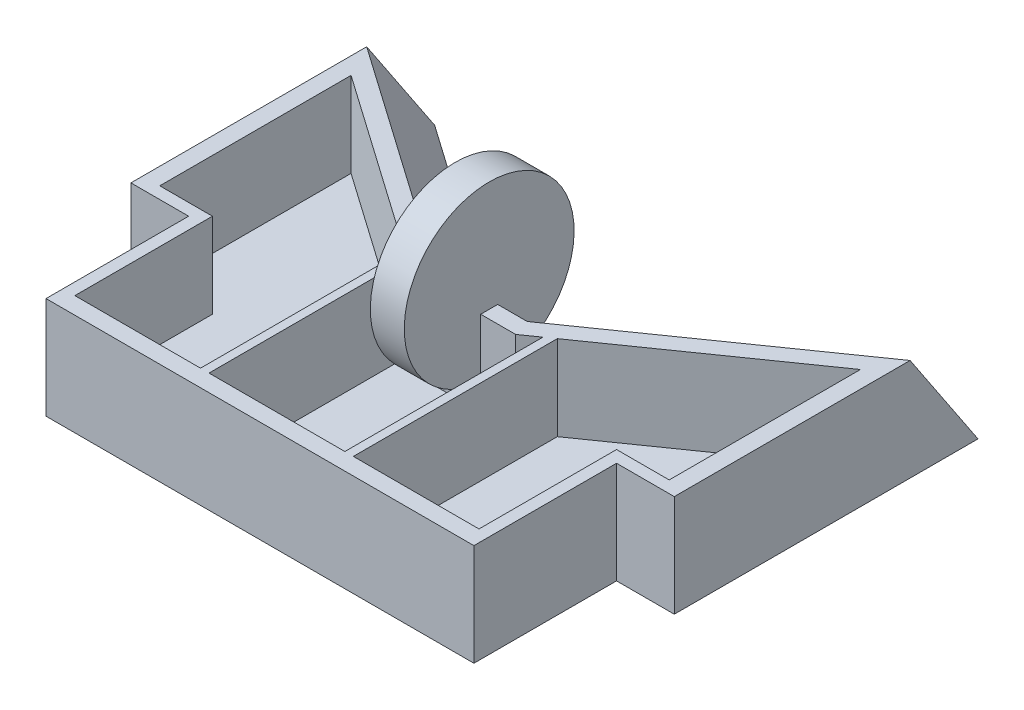
ISO-10303-21;
HEADER;
FILE_DESCRIPTION(('STEP AP214'),'2;1');
FILE_NAME('part.step','',(''),(''),'','','');
FILE_SCHEMA(('AUTOMOTIVE_DESIGN { 1 0 10303 214 1 1 1 1 }'));
ENDSEC;
DATA;
#1=APPLICATION_CONTEXT('core data for automotive mechanical design processes');
#2=APPLICATION_PROTOCOL_DEFINITION('international standard','automotive_design',2000,#1);
#3=PRODUCT_CONTEXT('',#1,'mechanical');
#4=PRODUCT('Part','Part','',(#3));
#5=PRODUCT_RELATED_PRODUCT_CATEGORY('part','',(#4));
#6=PRODUCT_DEFINITION_FORMATION('','',#4);
#7=PRODUCT_DEFINITION_CONTEXT('part definition',#1,'design');
#8=PRODUCT_DEFINITION('design','',#6,#7);
#9=PRODUCT_DEFINITION_SHAPE('','',#8);
#10=(LENGTH_UNIT() NAMED_UNIT(*) SI_UNIT(.MILLI.,.METRE.));
#11=(NAMED_UNIT(*) PLANE_ANGLE_UNIT() SI_UNIT($,.RADIAN.));
#12=(NAMED_UNIT(*) SI_UNIT($,.STERADIAN.) SOLID_ANGLE_UNIT());
#13=UNCERTAINTY_MEASURE_WITH_UNIT(LENGTH_MEASURE(1.E-05),#10,'distance_accuracy_value','');
#14=(GEOMETRIC_REPRESENTATION_CONTEXT(3) GLOBAL_UNCERTAINTY_ASSIGNED_CONTEXT((#13)) GLOBAL_UNIT_ASSIGNED_CONTEXT((#10,
#11,#12)) REPRESENTATION_CONTEXT('',''));
#15=CARTESIAN_POINT('',(0.,0.,0.));
#16=DIRECTION('',(0.,0.,1.));
#17=DIRECTION('',(1.,0.,0.));
#18=AXIS2_PLACEMENT_3D('',#15,#16,#17);
#19=CARTESIAN_POINT('',(-75.5649999999984,-226.739284890193,61.6029072057912));
#20=DIRECTION('',(0.,0.,1.));
#21=DIRECTION('',(1.,0.,0.));
#22=AXIS2_PLACEMENT_3D('',#19,#20,#21);
#23=PLANE('',#22);
#24=DIRECTION('',(0.,-1.,0.));
#25=VECTOR('',#24,1.);
#26=CARTESIAN_POINT('',(25.3999999999968,114.444963656099,61.6029072057911));
#27=LINE('',#26,#25);
#28=CARTESIAN_POINT('',(25.3999999999967,38.1,61.6029072057911));
#29=VERTEX_POINT('',#28);
#30=CARTESIAN_POINT('',(25.3999999999968,6.34999999999999,61.6029072057911));
#31=VERTEX_POINT('',#30);
#32=EDGE_CURVE('E283',#29,#31,#27,.T.);
#33=ORIENTED_EDGE('',*,*,#32,.T.);
#34=DIRECTION('',(-1.,0.,0.));
#35=VECTOR('',#34,1.);
#36=CARTESIAN_POINT('',(-75.5649999999984,6.34999999999999,61.6029072057912));
#37=LINE('',#36,#35);
#38=CARTESIAN_POINT('',(-25.3999999999968,6.35,61.6029072057912));
#39=VERTEX_POINT('',#38);
#40=EDGE_CURVE('E344',#31,#39,#37,.T.);
#41=ORIENTED_EDGE('',*,*,#40,.T.);
#42=DIRECTION('',(0.,-1.,0.));
#43=VECTOR('',#42,1.);
#44=CARTESIAN_POINT('',(-25.3999999999968,114.444963656099,61.6029072057912));
#45=LINE('',#44,#43);
#46=CARTESIAN_POINT('',(-25.3999999999968,38.1,61.6029072057912));
#47=VERTEX_POINT('',#46);
#48=EDGE_CURVE('E304',#47,#39,#45,.T.);
#49=ORIENTED_EDGE('',*,*,#48,.F.);
#50=DIRECTION('',(1.,0.,0.));
#51=VECTOR('',#50,1.);
#52=CARTESIAN_POINT('',(-75.5649999999984,38.1,61.6029072057912));
#53=LINE('',#52,#51);
#54=EDGE_CURVE('E349',#47,#29,#53,.T.);
#55=ORIENTED_EDGE('',*,*,#54,.T.);
#56=EDGE_LOOP('',(#33,#41,#49,#55));
#57=FACE_BOUND('',#56,.T.);
#58=ADVANCED_FACE('F37',(#57),#23,.F.);
#59=DIRECTION('',(0.,-1.,0.));
#60=VECTOR('',#59,1.);
#61=CARTESIAN_POINT('',(28.5749999999968,114.444963656099,61.6029072057911));
#62=LINE('',#61,#60);
#63=CARTESIAN_POINT('',(28.5749999999968,38.1,61.6029072057911));
#64=VERTEX_POINT('',#63);
#65=CARTESIAN_POINT('',(28.5749999999968,6.34999999999999,61.6029072057911));
#66=VERTEX_POINT('',#65);
#67=EDGE_CURVE('E279',#64,#66,#62,.T.);
#68=ORIENTED_EDGE('',*,*,#67,.F.);
#69=CARTESIAN_POINT('',(75.5649999999985,38.1,61.6029072057911));
#70=VERTEX_POINT('',#69);
#71=EDGE_CURVE('E308',#64,#70,#53,.T.);
#72=ORIENTED_EDGE('',*,*,#71,.T.);
#73=DIRECTION('',(0.,1.,0.));
#74=VECTOR('',#73,1.);
#75=CARTESIAN_POINT('',(75.5649999999985,-226.739284890193,61.6029072057911));
#76=LINE('',#75,#74);
#77=CARTESIAN_POINT('',(75.5649999999985,6.34999999999999,61.6029072057911));
#78=VERTEX_POINT('',#77);
#79=EDGE_CURVE('E377',#78,#70,#76,.T.);
#80=ORIENTED_EDGE('',*,*,#79,.F.);
#81=EDGE_CURVE('E340',#78,#66,#37,.T.);
#82=ORIENTED_EDGE('',*,*,#81,.T.);
#83=EDGE_LOOP('',(#68,#72,#80,#82));
#84=FACE_BOUND('',#83,.T.);
#85=ADVANCED_FACE('F533',(#84),#23,.F.);
#86=CARTESIAN_POINT('',(0.,6.35,0.));
#87=DIRECTION('',(0.,1.,0.));
#88=DIRECTION('',(0.,0.,1.));
#89=AXIS2_PLACEMENT_3D('',#86,#87,#88);
#90=PLANE('',#89);
#91=ORIENTED_EDGE('',*,*,#40,.F.);
#92=DIRECTION('',(0.,0.,1.));
#93=VECTOR('',#92,1.);
#94=CARTESIAN_POINT('',(25.3999999999968,6.35,-12.4528487101146));
#95=LINE('',#94,#93);
#96=CARTESIAN_POINT('',(25.3999999999967,6.34999999999999,-12.4528487101145));
#97=VERTEX_POINT('',#96);
#98=EDGE_CURVE('E280',#97,#31,#95,.T.);
#99=ORIENTED_EDGE('',*,*,#98,.F.);
#100=DIRECTION('',(0.819152044288991,0.,-0.573576436351048));
#101=VECTOR('',#100,1.);
#102=CARTESIAN_POINT('',(95.25,6.34999999999999,-61.3623452540652));
#103=LINE('',#102,#101);
#104=CARTESIAN_POINT('',(19.3935580718522,6.34999999999999,-8.24709279420883));
#105=VERTEX_POINT('',#104);
#106=EDGE_CURVE('E324',#105,#97,#103,.T.);
#107=ORIENTED_EDGE('',*,*,#106,.F.);
#108=DIRECTION('',(1.,0.,0.));
#109=VECTOR('',#108,1.);
#110=CARTESIAN_POINT('',(19.3935580718522,6.34999999999999,-8.24709279420884));
#111=LINE('',#110,#109);
#112=CARTESIAN_POINT('',(-19.3935580718522,6.34999999999999,-8.24709279420884));
#113=VERTEX_POINT('',#112);
#114=EDGE_CURVE('E327',#113,#105,#111,.T.);
#115=ORIENTED_EDGE('',*,*,#114,.F.);
#116=DIRECTION('',(0.819152044288991,0.,0.573576436351047));
#117=VECTOR('',#116,1.);
#118=CARTESIAN_POINT('',(-19.3935580718522,6.34999999999999,-8.24709279420884));
#119=LINE('',#118,#117);
#120=CARTESIAN_POINT('',(-25.3999999999968,6.35,-12.4528487101146));
#121=VERTEX_POINT('',#120);
#122=EDGE_CURVE('E329',#121,#113,#119,.T.);
#123=ORIENTED_EDGE('',*,*,#122,.F.);
#124=DIRECTION('',(0.,0.,-1.));
#125=VECTOR('',#124,1.);
#126=CARTESIAN_POINT('',(-25.3999999999968,6.35,-12.4528487101146));
#127=LINE('',#126,#125);
#128=EDGE_CURVE('E301',#39,#121,#127,.T.);
#129=ORIENTED_EDGE('',*,*,#128,.F.);
#130=EDGE_LOOP('',(#91,#99,#107,#115,#123,#129));
#131=FACE_BOUND('',#130,.T.);
#132=ADVANCED_FACE('F540',(#131),#90,.T.);
#133=CARTESIAN_POINT('',(28.5749999999968,6.34999999999999,-14.6760076439304));
#134=VERTEX_POINT('',#133);
#135=CARTESIAN_POINT('',(95.25,6.34999999999999,-61.3623452540652));
#136=VERTEX_POINT('',#135);
#137=EDGE_CURVE('E323',#134,#136,#103,.T.);
#138=ORIENTED_EDGE('',*,*,#137,.F.);
#139=DIRECTION('',(0.,0.,-1.));
#140=VECTOR('',#139,1.);
#141=CARTESIAN_POINT('',(28.5749999999968,6.35,61.6029072057911));
#142=LINE('',#141,#140);
#143=EDGE_CURVE('E275',#66,#134,#142,.T.);
#144=ORIENTED_EDGE('',*,*,#143,.F.);
#145=ORIENTED_EDGE('',*,*,#81,.F.);
#146=DIRECTION('',(0.,0.,1.));
#147=VECTOR('',#146,1.);
#148=CARTESIAN_POINT('',(75.5649999999985,6.34999999999999,61.6029072057911));
#149=LINE('',#148,#147);
#150=CARTESIAN_POINT('',(75.5649999999985,6.34999999999999,10.1679072057912));
#151=VERTEX_POINT('',#150);
#152=EDGE_CURVE('E343',#151,#78,#149,.T.);
#153=ORIENTED_EDGE('',*,*,#152,.F.);
#154=DIRECTION('',(-1.,0.,0.));
#155=VECTOR('',#154,1.);
#156=CARTESIAN_POINT('',(75.5649999999985,6.34999999999999,10.1679072057912));
#157=LINE('',#156,#155);
#158=CARTESIAN_POINT('',(95.25,6.34999999999999,10.1679072057912));
#159=VERTEX_POINT('',#158);
#160=EDGE_CURVE('E318',#159,#151,#157,.T.);
#161=ORIENTED_EDGE('',*,*,#160,.F.);
#162=DIRECTION('',(0.,0.,1.));
#163=VECTOR('',#162,1.);
#164=CARTESIAN_POINT('',(95.25,6.34999999999999,10.1679072057912));
#165=LINE('',#164,#163);
#166=EDGE_CURVE('E320',#136,#159,#165,.T.);
#167=ORIENTED_EDGE('',*,*,#166,.F.);
#168=EDGE_LOOP('',(#138,#144,#145,#153,#161,#167));
#169=FACE_BOUND('',#168,.T.);
#170=ADVANCED_FACE('F601',(#169),#90,.T.);
#171=CARTESIAN_POINT('',(95.25,-226.739284890193,-61.3623452540652));
#172=DIRECTION('',(-0.573576436351048,0.,-0.819152044288991));
#173=DIRECTION('',(-0.819152044288991,0.,0.573576436351048));
#174=AXIS2_PLACEMENT_3D('',#171,#172,#173);
#175=PLANE('',#174);
#176=DIRECTION('',(0.,-1.,0.));
#177=VECTOR('',#176,1.);
#178=CARTESIAN_POINT('',(25.3999999999968,114.444963656099,-12.4528487101146));
#179=LINE('',#178,#177);
#180=CARTESIAN_POINT('',(25.3999999999968,38.1,-12.4528487101146));
#181=VERTEX_POINT('',#180);
#182=EDGE_CURVE('E284',#181,#97,#179,.T.);
#183=ORIENTED_EDGE('',*,*,#182,.F.);
#184=DIRECTION('',(-0.819152044288991,0.,0.573576436351048));
#185=VECTOR('',#184,1.);
#186=CARTESIAN_POINT('',(95.25,38.1,-61.3623452540652));
#187=LINE('',#186,#185);
#188=CARTESIAN_POINT('',(19.3935580718522,38.1,-8.24709279420884));
#189=VERTEX_POINT('',#188);
#190=EDGE_CURVE('E358',#181,#189,#187,.T.);
#191=ORIENTED_EDGE('',*,*,#190,.T.);
#192=DIRECTION('',(0.,1.,0.));
#193=VECTOR('',#192,1.);
#194=CARTESIAN_POINT('',(19.3935580718522,-226.739284890193,-8.24709279420884));
#195=LINE('',#194,#193);
#196=EDGE_CURVE('E389',#105,#189,#195,.T.);
#197=ORIENTED_EDGE('',*,*,#196,.F.);
#198=ORIENTED_EDGE('',*,*,#106,.T.);
#199=EDGE_LOOP('',(#183,#191,#197,#198));
#200=FACE_BOUND('',#199,.T.);
#201=ADVANCED_FACE('F555',(#200),#175,.F.);
#202=DIRECTION('',(0.,-1.,0.));
#203=VECTOR('',#202,1.);
#204=CARTESIAN_POINT('',(28.5749999999968,114.444963656099,-14.6760076439304));
#205=LINE('',#204,#203);
#206=CARTESIAN_POINT('',(28.5749999999968,38.1,-14.6760076439304));
#207=VERTEX_POINT('',#206);
#208=EDGE_CURVE('E274',#207,#134,#205,.T.);
#209=ORIENTED_EDGE('',*,*,#208,.T.);
#210=ORIENTED_EDGE('',*,*,#137,.T.);
#211=DIRECTION('',(0.,1.,0.));
#212=VECTOR('',#211,1.);
#213=CARTESIAN_POINT('',(95.25,-226.739284890193,-61.3623452540652));
#214=LINE('',#213,#212);
#215=CARTESIAN_POINT('',(95.25,38.1,-61.3623452540652));
#216=VERTEX_POINT('',#215);
#217=EDGE_CURVE('E392',#136,#216,#214,.T.);
#218=ORIENTED_EDGE('',*,*,#217,.T.);
#219=EDGE_CURVE('E359',#216,#207,#187,.T.);
#220=ORIENTED_EDGE('',*,*,#219,.T.);
#221=EDGE_LOOP('',(#209,#210,#218,#220));
#222=FACE_BOUND('',#221,.T.);
#223=ADVANCED_FACE('F546',(#222),#175,.F.);
#224=DIRECTION('',(0.,-1.,0.));
#225=VECTOR('',#224,1.);
#226=CARTESIAN_POINT('',(-28.5749999999968,114.444963656099,61.6029072057912));
#227=LINE('',#226,#225);
#228=CARTESIAN_POINT('',(-28.5749999999968,38.1,61.6029072057912));
#229=VERTEX_POINT('',#228);
#230=CARTESIAN_POINT('',(-28.5749999999968,6.35,61.6029072057912));
#231=VERTEX_POINT('',#230);
#232=EDGE_CURVE('E288',#229,#231,#227,.T.);
#233=ORIENTED_EDGE('',*,*,#232,.T.);
#234=CARTESIAN_POINT('',(-75.5649999999984,6.34999999999999,61.6029072057912));
#235=VERTEX_POINT('',#234);
#236=EDGE_CURVE('E339',#231,#235,#37,.T.);
#237=ORIENTED_EDGE('',*,*,#236,.T.);
#238=DIRECTION('',(0.,1.,0.));
#239=VECTOR('',#238,1.);
#240=CARTESIAN_POINT('',(-75.5649999999984,-226.739284890193,61.6029072057912));
#241=LINE('',#240,#239);
#242=CARTESIAN_POINT('',(-75.5649999999984,38.1,61.6029072057912));
#243=VERTEX_POINT('',#242);
#244=EDGE_CURVE('E321',#235,#243,#241,.T.);
#245=ORIENTED_EDGE('',*,*,#244,.T.);
#246=EDGE_CURVE('E345',#243,#229,#53,.T.);
#247=ORIENTED_EDGE('',*,*,#246,.T.);
#248=EDGE_LOOP('',(#233,#237,#245,#247));
#249=FACE_BOUND('',#248,.T.);
#250=ADVANCED_FACE('F536',(#249),#23,.F.);
#251=CARTESIAN_POINT('',(-19.3935580718522,-226.739284890193,-8.24709279420884));
#252=DIRECTION('',(0.573576436351047,0.,-0.819152044288991));
#253=DIRECTION('',(-0.819152044288991,0.,-0.573576436351047));
#254=AXIS2_PLACEMENT_3D('',#251,#252,#253);
#255=PLANE('',#254);
#256=DIRECTION('',(0.,-1.,0.));
#257=VECTOR('',#256,1.);
#258=CARTESIAN_POINT('',(-25.3999999999968,114.444963656099,-12.4528487101146));
#259=LINE('',#258,#257);
#260=CARTESIAN_POINT('',(-25.3999999999968,38.1,-12.4528487101146));
#261=VERTEX_POINT('',#260);
#262=EDGE_CURVE('E303',#261,#121,#259,.T.);
#263=ORIENTED_EDGE('',*,*,#262,.T.);
#264=ORIENTED_EDGE('',*,*,#122,.T.);
#265=DIRECTION('',(0.,1.,0.));
#266=VECTOR('',#265,1.);
#267=CARTESIAN_POINT('',(-19.3935580718522,-226.739284890193,-8.24709279420884));
#268=LINE('',#267,#266);
#269=CARTESIAN_POINT('',(-19.3935580718522,38.1,-8.24709279420884));
#270=VERTEX_POINT('',#269);
#271=EDGE_CURVE('E386',#113,#270,#268,.T.);
#272=ORIENTED_EDGE('',*,*,#271,.T.);
#273=DIRECTION('',(-0.819152044288991,0.,-0.573576436351047));
#274=VECTOR('',#273,1.);
#275=CARTESIAN_POINT('',(-19.3935580718522,38.1,-8.24709279420884));
#276=LINE('',#275,#274);
#277=EDGE_CURVE('E365',#270,#261,#276,.T.);
#278=ORIENTED_EDGE('',*,*,#277,.T.);
#279=EDGE_LOOP('',(#263,#264,#272,#278));
#280=FACE_BOUND('',#279,.T.);
#281=ADVANCED_FACE('F545',(#280),#255,.F.);
#282=DIRECTION('',(0.,-1.,0.));
#283=VECTOR('',#282,1.);
#284=CARTESIAN_POINT('',(-28.5749999999968,114.444963656099,-14.6760076439304));
#285=LINE('',#284,#283);
#286=CARTESIAN_POINT('',(-28.5749999999968,38.1,-14.6760076439304));
#287=VERTEX_POINT('',#286);
#288=CARTESIAN_POINT('',(-28.5749999999968,6.35,-14.6760076439304));
#289=VERTEX_POINT('',#288);
#290=EDGE_CURVE('E300',#287,#289,#285,.T.);
#291=ORIENTED_EDGE('',*,*,#290,.F.);
#292=CARTESIAN_POINT('',(-95.25,38.1,-61.3623452540652));
#293=VERTEX_POINT('',#292);
#294=EDGE_CURVE('E364',#287,#293,#276,.T.);
#295=ORIENTED_EDGE('',*,*,#294,.T.);
#296=DIRECTION('',(0.,1.,0.));
#297=VECTOR('',#296,1.);
#298=CARTESIAN_POINT('',(-95.25,-226.739284890193,-61.3623452540652));
#299=LINE('',#298,#297);
#300=CARTESIAN_POINT('',(-95.25,6.34999999999999,-61.3623452540652));
#301=VERTEX_POINT('',#300);
#302=EDGE_CURVE('E383',#301,#293,#299,.T.);
#303=ORIENTED_EDGE('',*,*,#302,.F.);
#304=EDGE_CURVE('E330',#301,#289,#119,.T.);
#305=ORIENTED_EDGE('',*,*,#304,.T.);
#306=EDGE_LOOP('',(#291,#295,#303,#305));
#307=FACE_BOUND('',#306,.T.);
#308=ADVANCED_FACE('F552',(#307),#255,.F.);
#309=ORIENTED_EDGE('',*,*,#236,.F.);
#310=DIRECTION('',(0.,0.,1.));
#311=VECTOR('',#310,1.);
#312=CARTESIAN_POINT('',(-28.5749999999968,6.35,61.6029072057912));
#313=LINE('',#312,#311);
#314=EDGE_CURVE('E297',#289,#231,#313,.T.);
#315=ORIENTED_EDGE('',*,*,#314,.F.);
#316=ORIENTED_EDGE('',*,*,#304,.F.);
#317=DIRECTION('',(0.,0.,-1.));
#318=VECTOR('',#317,1.);
#319=CARTESIAN_POINT('',(-95.25,6.34999999999999,-61.3623452540652));
#320=LINE('',#319,#318);
#321=CARTESIAN_POINT('',(-95.25,6.34999999999999,10.1679072057912));
#322=VERTEX_POINT('',#321);
#323=EDGE_CURVE('E333',#322,#301,#320,.T.);
#324=ORIENTED_EDGE('',*,*,#323,.F.);
#325=DIRECTION('',(-1.,0.,0.));
#326=VECTOR('',#325,1.);
#327=CARTESIAN_POINT('',(-95.25,6.34999999999999,10.1679072057912));
#328=LINE('',#327,#326);
#329=CARTESIAN_POINT('',(-75.5649999999984,6.34999999999999,10.1679072057912));
#330=VERTEX_POINT('',#329);
#331=EDGE_CURVE('E335',#330,#322,#328,.T.);
#332=ORIENTED_EDGE('',*,*,#331,.F.);
#333=DIRECTION('',(0.,0.,-1.));
#334=VECTOR('',#333,1.);
#335=CARTESIAN_POINT('',(-75.5649999999984,6.34999999999999,61.6029072057912));
#336=LINE('',#335,#334);
#337=EDGE_CURVE('E337',#235,#330,#336,.T.);
#338=ORIENTED_EDGE('',*,*,#337,.F.);
#339=EDGE_LOOP('',(#309,#315,#316,#324,#332,#338));
#340=FACE_BOUND('',#339,.T.);
#341=ADVANCED_FACE('F564',(#340),#90,.T.);
#342=CARTESIAN_POINT('',(-101.6,38.1,0.));
#343=DIRECTION('',(1.,0.,0.));
#344=DIRECTION('',(0.,0.,-1.));
#345=AXIS2_PLACEMENT_3D('',#342,#343,#344);
#346=PLANE('',#345);
#347=DIRECTION('',(0.,-1.,0.));
#348=VECTOR('',#347,1.);
#349=CARTESIAN_POINT('',(-101.6,38.1,14.6129072057912));
#350=LINE('',#349,#348);
#351=CARTESIAN_POINT('',(-101.6,38.1,14.6129072057912));
#352=VERTEX_POINT('',#351);
#353=CARTESIAN_POINT('',(-101.6,0.,14.6129072057912));
#354=VERTEX_POINT('',#353);
#355=EDGE_CURVE('E259',#352,#354,#350,.T.);
#356=ORIENTED_EDGE('',*,*,#355,.F.);
#357=DIRECTION('',(0.,0.,1.));
#358=VECTOR('',#357,1.);
#359=CARTESIAN_POINT('',(-101.6,38.1,0.));
#360=LINE('',#359,#358);
#361=CARTESIAN_POINT('',(-101.6,38.1,-73.5605817603321));
#362=VERTEX_POINT('',#361);
#363=EDGE_CURVE('E430',#362,#352,#360,.T.);
#364=ORIENTED_EDGE('',*,*,#363,.F.);
#365=DIRECTION('',(0.,-0.832050294337844,-0.554700196225229));
#366=VECTOR('',#365,1.);
#367=CARTESIAN_POINT('',(-101.6,40.0492355635017,-72.2610913846644));
#368=LINE('',#367,#366);
#369=CARTESIAN_POINT('',(-101.6,0.,-98.9605817603321));
#370=VERTEX_POINT('',#369);
#371=EDGE_CURVE('E426',#362,#370,#368,.T.);
#372=ORIENTED_EDGE('',*,*,#371,.T.);
#373=DIRECTION('',(0.,0.,1.));
#374=VECTOR('',#373,1.);
#375=CARTESIAN_POINT('',(-101.6,0.,0.));
#376=LINE('',#375,#374);
#377=EDGE_CURVE('E429',#370,#354,#376,.T.);
#378=ORIENTED_EDGE('',*,*,#377,.T.);
#379=EDGE_LOOP('',(#356,#364,#372,#378));
#380=FACE_BOUND('',#379,.T.);
#381=ADVANCED_FACE('F39',(#380),#346,.F.);
#382=CARTESIAN_POINT('',(0.,38.1,14.6129072057912));
#383=DIRECTION('',(0.,0.,-1.));
#384=DIRECTION('',(-1.,0.,0.));
#385=AXIS2_PLACEMENT_3D('',#382,#383,#384);
#386=PLANE('',#385);
#387=DIRECTION('',(1.,0.,0.));
#388=VECTOR('',#387,1.);
#389=CARTESIAN_POINT('',(0.,0.,14.6129072057912));
#390=LINE('',#389,#388);
#391=CARTESIAN_POINT('',(-80.0099999999985,0.,14.6129072057912));
#392=VERTEX_POINT('',#391);
#393=EDGE_CURVE('E447',#354,#392,#390,.T.);
#394=ORIENTED_EDGE('',*,*,#393,.T.);
#395=DIRECTION('',(0.,-1.,0.));
#396=VECTOR('',#395,1.);
#397=CARTESIAN_POINT('',(-80.0099999999985,38.1,14.6129072057912));
#398=LINE('',#397,#396);
#399=CARTESIAN_POINT('',(-80.0099999999985,38.1,14.6129072057912));
#400=VERTEX_POINT('',#399);
#401=EDGE_CURVE('E469',#400,#392,#398,.T.);
#402=ORIENTED_EDGE('',*,*,#401,.F.);
#403=DIRECTION('',(1.,0.,0.));
#404=VECTOR('',#403,1.);
#405=CARTESIAN_POINT('',(0.,38.1,14.6129072057912));
#406=LINE('',#405,#404);
#407=EDGE_CURVE('E432',#352,#400,#406,.T.);
#408=ORIENTED_EDGE('',*,*,#407,.F.);
#409=ORIENTED_EDGE('',*,*,#355,.T.);
#410=EDGE_LOOP('',(#394,#402,#408,#409));
#411=FACE_BOUND('',#410,.T.);
#412=ADVANCED_FACE('F477',(#411),#386,.F.);
#413=CARTESIAN_POINT('',(-80.0099999999985,38.1,0.));
#414=DIRECTION('',(1.,0.,0.));
#415=DIRECTION('',(0.,0.,-1.));
#416=AXIS2_PLACEMENT_3D('',#413,#414,#415);
#417=PLANE('',#416);
#418=DIRECTION('',(0.,0.,1.));
#419=VECTOR('',#418,1.);
#420=CARTESIAN_POINT('',(-80.0099999999985,0.,0.));
#421=LINE('',#420,#419);
#422=CARTESIAN_POINT('',(-80.0099999999985,0.,67.9529072057912));
#423=VERTEX_POINT('',#422);
#424=EDGE_CURVE('E449',#392,#423,#421,.T.);
#425=ORIENTED_EDGE('',*,*,#424,.T.);
#426=DIRECTION('',(0.,-1.,0.));
#427=VECTOR('',#426,1.);
#428=CARTESIAN_POINT('',(-80.0099999999985,38.1,67.9529072057912));
#429=LINE('',#428,#427);
#430=CARTESIAN_POINT('',(-80.0099999999985,38.1,67.9529072057912));
#431=VERTEX_POINT('',#430);
#432=EDGE_CURVE('E466',#431,#423,#429,.T.);
#433=ORIENTED_EDGE('',*,*,#432,.F.);
#434=DIRECTION('',(0.,0.,1.));
#435=VECTOR('',#434,1.);
#436=CARTESIAN_POINT('',(-80.0099999999985,38.1,0.));
#437=LINE('',#436,#435);
#438=EDGE_CURVE('E435',#400,#431,#437,.T.);
#439=ORIENTED_EDGE('',*,*,#438,.F.);
#440=ORIENTED_EDGE('',*,*,#401,.T.);
#441=EDGE_LOOP('',(#425,#433,#439,#440));
#442=FACE_BOUND('',#441,.T.);
#443=ADVANCED_FACE('F487',(#442),#417,.F.);
#444=CARTESIAN_POINT('',(0.,38.1,67.9529072057912));
#445=DIRECTION('',(0.,0.,-1.));
#446=DIRECTION('',(-1.,0.,0.));
#447=AXIS2_PLACEMENT_3D('',#444,#445,#446);
#448=PLANE('',#447);
#449=DIRECTION('',(1.,0.,0.));
#450=VECTOR('',#449,1.);
#451=CARTESIAN_POINT('',(0.,0.,67.9529072057912));
#452=LINE('',#451,#450);
#453=CARTESIAN_POINT('',(80.0099999999985,0.,67.9529072057911));
#454=VERTEX_POINT('',#453);
#455=EDGE_CURVE('E451',#423,#454,#452,.T.);
#456=ORIENTED_EDGE('',*,*,#455,.T.);
#457=DIRECTION('',(0.,-1.,0.));
#458=VECTOR('',#457,1.);
#459=CARTESIAN_POINT('',(80.0099999999985,38.1,67.9529072057911));
#460=LINE('',#459,#458);
#461=CARTESIAN_POINT('',(80.0099999999985,38.1,67.9529072057911));
#462=VERTEX_POINT('',#461);
#463=EDGE_CURVE('E463',#462,#454,#460,.T.);
#464=ORIENTED_EDGE('',*,*,#463,.F.);
#465=DIRECTION('',(1.,0.,0.));
#466=VECTOR('',#465,1.);
#467=CARTESIAN_POINT('',(0.,38.1,67.9529072057912));
#468=LINE('',#467,#466);
#469=EDGE_CURVE('E437',#431,#462,#468,.T.);
#470=ORIENTED_EDGE('',*,*,#469,.F.);
#471=ORIENTED_EDGE('',*,*,#432,.T.);
#472=EDGE_LOOP('',(#456,#464,#470,#471));
#473=FACE_BOUND('',#472,.T.);
#474=ADVANCED_FACE('F491',(#473),#448,.F.);
#475=CARTESIAN_POINT('',(80.0099999999985,38.1,0.));
#476=DIRECTION('',(-1.,0.,0.));
#477=DIRECTION('',(0.,0.,1.));
#478=AXIS2_PLACEMENT_3D('',#475,#476,#477);
#479=PLANE('',#478);
#480=DIRECTION('',(0.,0.,-1.));
#481=VECTOR('',#480,1.);
#482=CARTESIAN_POINT('',(80.0099999999985,0.,0.));
#483=LINE('',#482,#481);
#484=CARTESIAN_POINT('',(80.0099999999985,0.,14.6129072057912));
#485=VERTEX_POINT('',#484);
#486=EDGE_CURVE('E453',#454,#485,#483,.T.);
#487=ORIENTED_EDGE('',*,*,#486,.T.);
#488=DIRECTION('',(0.,-1.,0.));
#489=VECTOR('',#488,1.);
#490=CARTESIAN_POINT('',(80.0099999999985,38.1,14.6129072057912));
#491=LINE('',#490,#489);
#492=CARTESIAN_POINT('',(80.0099999999985,38.1,14.6129072057912));
#493=VERTEX_POINT('',#492);
#494=EDGE_CURVE('E460',#493,#485,#491,.T.);
#495=ORIENTED_EDGE('',*,*,#494,.F.);
#496=DIRECTION('',(0.,0.,-1.));
#497=VECTOR('',#496,1.);
#498=CARTESIAN_POINT('',(80.0099999999985,38.1,0.));
#499=LINE('',#498,#497);
#500=EDGE_CURVE('E439',#462,#493,#499,.T.);
#501=ORIENTED_EDGE('',*,*,#500,.F.);
#502=ORIENTED_EDGE('',*,*,#463,.T.);
#503=EDGE_LOOP('',(#487,#495,#501,#502));
#504=FACE_BOUND('',#503,.T.);
#505=ADVANCED_FACE('F523',(#504),#479,.F.);
#506=CARTESIAN_POINT('',(0.,38.1,14.6129072057912));
#507=DIRECTION('',(0.,0.,-1.));
#508=DIRECTION('',(-1.,0.,0.));
#509=AXIS2_PLACEMENT_3D('',#506,#507,#508);
#510=PLANE('',#509);
#511=DIRECTION('',(1.,0.,0.));
#512=VECTOR('',#511,1.);
#513=CARTESIAN_POINT('',(0.,0.,14.6129072057912));
#514=LINE('',#513,#512);
#515=CARTESIAN_POINT('',(101.6,0.,14.6129072057912));
#516=VERTEX_POINT('',#515);
#517=EDGE_CURVE('E455',#485,#516,#514,.T.);
#518=ORIENTED_EDGE('',*,*,#517,.T.);
#519=DIRECTION('',(0.,-1.,0.));
#520=VECTOR('',#519,1.);
#521=CARTESIAN_POINT('',(101.6,38.1,14.6129072057912));
#522=LINE('',#521,#520);
#523=CARTESIAN_POINT('',(101.6,38.1,14.6129072057912));
#524=VERTEX_POINT('',#523);
#525=EDGE_CURVE('E445',#524,#516,#522,.T.);
#526=ORIENTED_EDGE('',*,*,#525,.F.);
#527=DIRECTION('',(1.,0.,0.));
#528=VECTOR('',#527,1.);
#529=CARTESIAN_POINT('',(0.,38.1,14.6129072057912));
#530=LINE('',#529,#528);
#531=EDGE_CURVE('E441',#493,#524,#530,.T.);
#532=ORIENTED_EDGE('',*,*,#531,.F.);
#533=ORIENTED_EDGE('',*,*,#494,.T.);
#534=EDGE_LOOP('',(#518,#526,#532,#533));
#535=FACE_BOUND('',#534,.T.);
#536=ADVANCED_FACE('F521',(#535),#510,.F.);
#537=CARTESIAN_POINT('',(101.6,38.1,0.));
#538=DIRECTION('',(-1.,0.,0.));
#539=DIRECTION('',(0.,0.,1.));
#540=AXIS2_PLACEMENT_3D('',#537,#538,#539);
#541=PLANE('',#540);
#542=DIRECTION('',(0.,-0.832050294337844,-0.554700196225229));
#543=VECTOR('',#542,1.);
#544=CARTESIAN_POINT('',(101.6,40.0492355635017,-72.2610913846644));
#545=LINE('',#544,#543);
#546=CARTESIAN_POINT('',(101.6,38.1,-73.5605817603321));
#547=VERTEX_POINT('',#546);
#548=CARTESIAN_POINT('',(101.6,0.,-98.9605817603322));
#549=VERTEX_POINT('',#548);
#550=EDGE_CURVE('E421',#547,#549,#545,.T.);
#551=ORIENTED_EDGE('',*,*,#550,.F.);
#552=DIRECTION('',(0.,0.,-1.));
#553=VECTOR('',#552,1.);
#554=CARTESIAN_POINT('',(101.6,38.1,0.));
#555=LINE('',#554,#553);
#556=EDGE_CURVE('E443',#524,#547,#555,.T.);
#557=ORIENTED_EDGE('',*,*,#556,.F.);
#558=ORIENTED_EDGE('',*,*,#525,.T.);
#559=DIRECTION('',(0.,0.,-1.));
#560=VECTOR('',#559,1.);
#561=CARTESIAN_POINT('',(101.6,0.,0.));
#562=LINE('',#561,#560);
#563=EDGE_CURVE('E433',#516,#549,#562,.T.);
#564=ORIENTED_EDGE('',*,*,#563,.T.);
#565=EDGE_LOOP('',(#551,#557,#558,#564));
#566=FACE_BOUND('',#565,.T.);
#567=ADVANCED_FACE('F516',(#566),#541,.F.);
#568=CARTESIAN_POINT('',(0.,38.1,0.));
#569=DIRECTION('',(0.,1.,0.));
#570=DIRECTION('',(0.,0.,1.));
#571=AXIS2_PLACEMENT_3D('',#568,#569,#570);
#572=PLANE('',#571);
#573=DIRECTION('',(0.,0.,-1.));
#574=VECTOR('',#573,1.);
#575=CARTESIAN_POINT('',(6.35,38.1,0.));
#576=LINE('',#575,#574);
#577=CARTESIAN_POINT('',(6.35,38.1,-8.24709279420884));
#578=VERTEX_POINT('',#577);
#579=CARTESIAN_POINT('',(6.35,38.1,-14.5970927942088));
#580=VERTEX_POINT('',#579);
#581=EDGE_CURVE('E268',#578,#580,#576,.T.);
#582=ORIENTED_EDGE('',*,*,#581,.F.);
#583=DIRECTION('',(-1.,0.,0.));
#584=VECTOR('',#583,1.);
#585=CARTESIAN_POINT('',(19.3935580718522,38.1,-8.24709279420884));
#586=LINE('',#585,#584);
#587=EDGE_CURVE('E362',#189,#578,#586,.T.);
#588=ORIENTED_EDGE('',*,*,#587,.F.);
#589=ORIENTED_EDGE('',*,*,#190,.F.);
#590=DIRECTION('',(0.,0.,1.));
#591=VECTOR('',#590,1.);
#592=CARTESIAN_POINT('',(25.3999999999968,38.1,-12.4528487101146));
#593=LINE('',#592,#591);
#594=EDGE_CURVE('E285',#181,#29,#593,.T.);
#595=ORIENTED_EDGE('',*,*,#594,.T.);
#596=ORIENTED_EDGE('',*,*,#54,.F.);
#597=DIRECTION('',(0.,0.,-1.));
#598=VECTOR('',#597,1.);
#599=CARTESIAN_POINT('',(-25.3999999999968,38.1,-12.4528487101146));
#600=LINE('',#599,#598);
#601=EDGE_CURVE('E305',#47,#261,#600,.T.);
#602=ORIENTED_EDGE('',*,*,#601,.T.);
#603=ORIENTED_EDGE('',*,*,#277,.F.);
#604=CARTESIAN_POINT('',(-6.35,38.1,-8.24709279420884));
#605=VERTEX_POINT('',#604);
#606=EDGE_CURVE('E361',#605,#270,#586,.T.);
#607=ORIENTED_EDGE('',*,*,#606,.F.);
#608=DIRECTION('',(0.,0.,-1.));
#609=VECTOR('',#608,1.);
#610=CARTESIAN_POINT('',(-6.35,38.1,0.));
#611=LINE('',#610,#609);
#612=CARTESIAN_POINT('',(-6.35,38.1,-14.5970927942088));
#613=VERTEX_POINT('',#612);
#614=EDGE_CURVE('E258',#605,#613,#611,.T.);
#615=ORIENTED_EDGE('',*,*,#614,.T.);
#616=DIRECTION('',(1.,0.,0.));
#617=VECTOR('',#616,1.);
#618=CARTESIAN_POINT('',(-17.3914107624707,38.1,-14.5970927942088));
#619=LINE('',#618,#617);
#620=CARTESIAN_POINT('',(-17.3914107624707,38.1,-14.5970927942088));
#621=VERTEX_POINT('',#620);
#622=EDGE_CURVE('E416',#621,#613,#619,.T.);
#623=ORIENTED_EDGE('',*,*,#622,.F.);
#624=DIRECTION('',(0.819152044288991,0.,0.573576436351047));
#625=VECTOR('',#624,1.);
#626=CARTESIAN_POINT('',(-100.989439241601,38.1,-73.1330625147663));
#627=LINE('',#626,#625);
#628=EDGE_CURVE('E411',#362,#621,#627,.T.);
#629=ORIENTED_EDGE('',*,*,#628,.F.);
#630=ORIENTED_EDGE('',*,*,#363,.T.);
#631=ORIENTED_EDGE('',*,*,#407,.T.);
#632=ORIENTED_EDGE('',*,*,#438,.T.);
#633=ORIENTED_EDGE('',*,*,#469,.T.);
#634=ORIENTED_EDGE('',*,*,#500,.T.);
#635=ORIENTED_EDGE('',*,*,#531,.T.);
#636=ORIENTED_EDGE('',*,*,#556,.T.);
#637=DIRECTION('',(0.819152044288991,0.,-0.573576436351048));
#638=VECTOR('',#637,1.);
#639=CARTESIAN_POINT('',(16.780850004072,38.1,-14.1695735486431));
#640=LINE('',#639,#638);
#641=CARTESIAN_POINT('',(17.3914107624707,38.1,-14.5970927942088));
#642=VERTEX_POINT('',#641);
#643=EDGE_CURVE('E405',#642,#547,#640,.T.);
#644=ORIENTED_EDGE('',*,*,#643,.F.);
#645=EDGE_CURVE('E418',#580,#642,#619,.T.);
#646=ORIENTED_EDGE('',*,*,#645,.F.);
#647=EDGE_LOOP('',(#582,#588,#589,#595,#596,#602,#603,#607,#615,#623,#629,#630,#631,#632,#633,
#634,#635,#636,#644,#646));
#648=FACE_BOUND('',#647,.T.);
#649=ORIENTED_EDGE('',*,*,#71,.F.);
#650=DIRECTION('',(0.,0.,-1.));
#651=VECTOR('',#650,1.);
#652=CARTESIAN_POINT('',(28.5749999999968,38.1,61.6029072057911));
#653=LINE('',#652,#651);
#654=EDGE_CURVE('E278',#64,#207,#653,.T.);
#655=ORIENTED_EDGE('',*,*,#654,.T.);
#656=ORIENTED_EDGE('',*,*,#219,.F.);
#657=DIRECTION('',(0.,0.,-1.));
#658=VECTOR('',#657,1.);
#659=CARTESIAN_POINT('',(95.25,38.1,10.1679072057912));
#660=LINE('',#659,#658);
#661=CARTESIAN_POINT('',(95.25,38.1,10.1679072057912));
#662=VERTEX_POINT('',#661);
#663=EDGE_CURVE('E355',#662,#216,#660,.T.);
#664=ORIENTED_EDGE('',*,*,#663,.F.);
#665=DIRECTION('',(1.,0.,0.));
#666=VECTOR('',#665,1.);
#667=CARTESIAN_POINT('',(75.5649999999985,38.1,10.1679072057912));
#668=LINE('',#667,#666);
#669=CARTESIAN_POINT('',(75.5649999999985,38.1,10.1679072057912));
#670=VERTEX_POINT('',#669);
#671=EDGE_CURVE('E352',#670,#662,#668,.T.);
#672=ORIENTED_EDGE('',*,*,#671,.F.);
#673=DIRECTION('',(0.,0.,-1.));
#674=VECTOR('',#673,1.);
#675=CARTESIAN_POINT('',(75.5649999999985,38.1,61.6029072057911));
#676=LINE('',#675,#674);
#677=EDGE_CURVE('E348',#70,#670,#676,.T.);
#678=ORIENTED_EDGE('',*,*,#677,.F.);
#679=EDGE_LOOP('',(#649,#655,#656,#664,#672,#678));
#680=FACE_BOUND('',#679,.T.);
#681=ORIENTED_EDGE('',*,*,#246,.F.);
#682=DIRECTION('',(0.,0.,1.));
#683=VECTOR('',#682,1.);
#684=CARTESIAN_POINT('',(-75.5649999999984,38.1,61.6029072057912));
#685=LINE('',#684,#683);
#686=CARTESIAN_POINT('',(-75.5649999999984,38.1,10.1679072057912));
#687=VERTEX_POINT('',#686);
#688=EDGE_CURVE('E374',#687,#243,#685,.T.);
#689=ORIENTED_EDGE('',*,*,#688,.F.);
#690=DIRECTION('',(1.,0.,0.));
#691=VECTOR('',#690,1.);
#692=CARTESIAN_POINT('',(-95.25,38.1,10.1679072057912));
#693=LINE('',#692,#691);
#694=CARTESIAN_POINT('',(-95.25,38.1,10.1679072057912));
#695=VERTEX_POINT('',#694);
#696=EDGE_CURVE('E371',#695,#687,#693,.T.);
#697=ORIENTED_EDGE('',*,*,#696,.F.);
#698=DIRECTION('',(0.,0.,1.));
#699=VECTOR('',#698,1.);
#700=CARTESIAN_POINT('',(-95.25,38.1,-61.3623452540652));
#701=LINE('',#700,#699);
#702=EDGE_CURVE('E368',#293,#695,#701,.T.);
#703=ORIENTED_EDGE('',*,*,#702,.F.);
#704=ORIENTED_EDGE('',*,*,#294,.F.);
#705=DIRECTION('',(0.,0.,1.));
#706=VECTOR('',#705,1.);
#707=CARTESIAN_POINT('',(-28.5749999999968,38.1,61.6029072057912));
#708=LINE('',#707,#706);
#709=EDGE_CURVE('E299',#287,#229,#708,.T.);
#710=ORIENTED_EDGE('',*,*,#709,.T.);
#711=EDGE_LOOP('',(#681,#689,#697,#703,#704,#710));
#712=FACE_BOUND('',#711,.T.);
#713=ADVANCED_FACE('F495',(#648,#680,#712),#572,.T.);
#714=CARTESIAN_POINT('',(0.,0.,0.));
#715=DIRECTION('',(0.,1.,0.));
#716=DIRECTION('',(0.,0.,1.));
#717=AXIS2_PLACEMENT_3D('',#714,#715,#716);
#718=PLANE('',#717);
#719=DIRECTION('',(0.819152044288991,0.,-0.573576436351047));
#720=VECTOR('',#719,1.);
#721=CARTESIAN_POINT('',(17.3914107624707,0.,-39.9970927942089));
#722=LINE('',#721,#720);
#723=CARTESIAN_POINT('',(17.3914107624707,0.,-39.9970927942089));
#724=VERTEX_POINT('',#723);
#725=EDGE_CURVE('E402',#724,#549,#722,.T.);
#726=ORIENTED_EDGE('',*,*,#725,.T.);
#727=ORIENTED_EDGE('',*,*,#563,.F.);
#728=ORIENTED_EDGE('',*,*,#517,.F.);
#729=ORIENTED_EDGE('',*,*,#486,.F.);
#730=ORIENTED_EDGE('',*,*,#455,.F.);
#731=ORIENTED_EDGE('',*,*,#424,.F.);
#732=ORIENTED_EDGE('',*,*,#393,.F.);
#733=ORIENTED_EDGE('',*,*,#377,.F.);
#734=DIRECTION('',(0.819152044288991,0.,0.573576436351047));
#735=VECTOR('',#734,1.);
#736=CARTESIAN_POINT('',(-101.6,0.,-98.9605817603321));
#737=LINE('',#736,#735);
#738=CARTESIAN_POINT('',(-17.3914107624707,0.,-39.9970927942088));
#739=VERTEX_POINT('',#738);
#740=EDGE_CURVE('E401',#370,#739,#737,.T.);
#741=ORIENTED_EDGE('',*,*,#740,.T.);
#742=DIRECTION('',(1.,0.,0.));
#743=VECTOR('',#742,1.);
#744=CARTESIAN_POINT('',(-17.3914107624707,0.,-39.9970927942088));
#745=LINE('',#744,#743);
#746=EDGE_CURVE('E406',#739,#724,#745,.T.);
#747=ORIENTED_EDGE('',*,*,#746,.T.);
#748=EDGE_LOOP('',(#726,#727,#728,#729,#730,#731,#732,#733,#741,#747));
#749=FACE_BOUND('',#748,.T.);
#750=ADVANCED_FACE('F482',(#749),#718,.F.);
#751=CARTESIAN_POINT('',(17.3914107624707,40.0492355635017,-13.2976024185411));
#752=DIRECTION('',(-0.50340327103271,0.479289585408548,-0.718934378112822));
#753=DIRECTION('',(-0.819152044288991,0.,0.573576436351048));
#754=AXIS2_PLACEMENT_3D('',#751,#752,#753);
#755=PLANE('',#754);
#756=DIRECTION('',(0.,-0.832050294337844,-0.554700196225229));
#757=VECTOR('',#756,1.);
#758=CARTESIAN_POINT('',(17.3914107624707,40.0492355635017,-13.2976024185411));
#759=LINE('',#758,#757);
#760=EDGE_CURVE('E415',#642,#724,#759,.T.);
#761=ORIENTED_EDGE('',*,*,#760,.F.);
#762=ORIENTED_EDGE('',*,*,#643,.T.);
#763=ORIENTED_EDGE('',*,*,#550,.T.);
#764=ORIENTED_EDGE('',*,*,#725,.F.);
#765=EDGE_LOOP('',(#761,#762,#763,#764));
#766=FACE_BOUND('',#765,.T.);
#767=ADVANCED_FACE('F511',(#766),#755,.T.);
#768=CARTESIAN_POINT('',(-17.3914107624707,40.0492355635017,-13.2976024185411));
#769=DIRECTION('',(0.,0.554700196225229,-0.832050294337843));
#770=DIRECTION('',(0.,0.832050294337843,0.554700196225229));
#771=AXIS2_PLACEMENT_3D('',#768,#769,#770);
#772=PLANE('',#771);
#773=DIRECTION('',(0.,-0.832050294337843,-0.554700196225229));
#774=VECTOR('',#773,1.);
#775=CARTESIAN_POINT('',(6.35,40.0492355635017,-13.2976024185411));
#776=LINE('',#775,#774);
#777=CARTESIAN_POINT('',(6.35,19.833622888279,-26.7746775353562));
#778=VERTEX_POINT('',#777);
#779=EDGE_CURVE('E271',#580,#778,#776,.T.);
#780=ORIENTED_EDGE('',*,*,#779,.F.);
#781=ORIENTED_EDGE('',*,*,#645,.T.);
#782=ORIENTED_EDGE('',*,*,#760,.T.);
#783=ORIENTED_EDGE('',*,*,#746,.F.);
#784=DIRECTION('',(0.,-0.832050294337844,-0.554700196225229));
#785=VECTOR('',#784,1.);
#786=CARTESIAN_POINT('',(-17.3914107624707,40.0492355635017,-13.2976024185411));
#787=LINE('',#786,#785);
#788=EDGE_CURVE('E414',#621,#739,#787,.T.);
#789=ORIENTED_EDGE('',*,*,#788,.F.);
#790=ORIENTED_EDGE('',*,*,#622,.T.);
#791=DIRECTION('',(0.,-0.832050294337843,-0.554700196225229));
#792=VECTOR('',#791,1.);
#793=CARTESIAN_POINT('',(-6.35,40.0492355635017,-13.2976024185411));
#794=LINE('',#793,#792);
#795=CARTESIAN_POINT('',(-6.35,19.833622888279,-26.7746775353562));
#796=VERTEX_POINT('',#795);
#797=EDGE_CURVE('E57',#613,#796,#794,.T.);
#798=ORIENTED_EDGE('',*,*,#797,.T.);
#799=DIRECTION('',(-1.,0.,0.));
#800=VECTOR('',#799,1.);
#801=CARTESIAN_POINT('',(6.35,19.833622888279,-26.7746775353562));
#802=LINE('',#801,#800);
#803=EDGE_CURVE('E52',#796,#778,#802,.F.);
#804=ORIENTED_EDGE('',*,*,#803,.T.);
#805=EDGE_LOOP('',(#780,#781,#782,#783,#789,#790,#798,#804));
#806=FACE_BOUND('',#805,.T.);
#807=ADVANCED_FACE('F506',(#806),#772,.T.);
#808=CARTESIAN_POINT('',(-101.6,40.0492355635017,-72.2610913846644));
#809=DIRECTION('',(0.50340327103271,0.479289585408548,-0.718934378112822));
#810=DIRECTION('',(-0.819152044288991,0.,-0.573576436351047));
#811=AXIS2_PLACEMENT_3D('',#808,#809,#810);
#812=PLANE('',#811);
#813=ORIENTED_EDGE('',*,*,#371,.F.);
#814=ORIENTED_EDGE('',*,*,#628,.T.);
#815=ORIENTED_EDGE('',*,*,#788,.T.);
#816=ORIENTED_EDGE('',*,*,#740,.F.);
#817=EDGE_LOOP('',(#813,#814,#815,#816));
#818=FACE_BOUND('',#817,.T.);
#819=ADVANCED_FACE('F502',(#818),#812,.T.);
#820=CARTESIAN_POINT('',(-75.5649999999984,-226.739284890193,61.6029072057912));
#821=DIRECTION('',(-1.,0.,0.));
#822=DIRECTION('',(0.,0.,1.));
#823=AXIS2_PLACEMENT_3D('',#820,#821,#822);
#824=PLANE('',#823);
#825=ORIENTED_EDGE('',*,*,#337,.T.);
#826=DIRECTION('',(0.,1.,0.));
#827=VECTOR('',#826,1.);
#828=CARTESIAN_POINT('',(-75.5649999999984,-226.739284890193,10.1679072057912));
#829=LINE('',#828,#827);
#830=EDGE_CURVE('E379',#330,#687,#829,.T.);
#831=ORIENTED_EDGE('',*,*,#830,.T.);
#832=ORIENTED_EDGE('',*,*,#688,.T.);
#833=ORIENTED_EDGE('',*,*,#244,.F.);
#834=EDGE_LOOP('',(#825,#831,#832,#833));
#835=FACE_BOUND('',#834,.T.);
#836=ADVANCED_FACE('F633',(#835),#824,.F.);
#837=CARTESIAN_POINT('',(-95.25,-226.739284890193,10.1679072057912));
#838=DIRECTION('',(0.,0.,1.));
#839=DIRECTION('',(1.,0.,0.));
#840=AXIS2_PLACEMENT_3D('',#837,#838,#839);
#841=PLANE('',#840);
#842=ORIENTED_EDGE('',*,*,#331,.T.);
#843=DIRECTION('',(0.,1.,0.));
#844=VECTOR('',#843,1.);
#845=CARTESIAN_POINT('',(-95.25,-226.739284890193,10.1679072057912));
#846=LINE('',#845,#844);
#847=EDGE_CURVE('E381',#322,#695,#846,.T.);
#848=ORIENTED_EDGE('',*,*,#847,.T.);
#849=ORIENTED_EDGE('',*,*,#696,.T.);
#850=ORIENTED_EDGE('',*,*,#830,.F.);
#851=EDGE_LOOP('',(#842,#848,#849,#850));
#852=FACE_BOUND('',#851,.T.);
#853=ADVANCED_FACE('F636',(#852),#841,.F.);
#854=CARTESIAN_POINT('',(-95.25,-226.739284890193,-61.3623452540652));
#855=DIRECTION('',(-1.,0.,0.));
#856=DIRECTION('',(0.,0.,1.));
#857=AXIS2_PLACEMENT_3D('',#854,#855,#856);
#858=PLANE('',#857);
#859=ORIENTED_EDGE('',*,*,#323,.T.);
#860=ORIENTED_EDGE('',*,*,#302,.T.);
#861=ORIENTED_EDGE('',*,*,#702,.T.);
#862=ORIENTED_EDGE('',*,*,#847,.F.);
#863=EDGE_LOOP('',(#859,#860,#861,#862));
#864=FACE_BOUND('',#863,.T.);
#865=ADVANCED_FACE('F616',(#864),#858,.F.);
#866=CARTESIAN_POINT('',(19.3935580718522,-226.739284890193,-8.24709279420884));
#867=DIRECTION('',(0.,0.,-1.));
#868=DIRECTION('',(-1.,0.,0.));
#869=AXIS2_PLACEMENT_3D('',#866,#867,#868);
#870=PLANE('',#869);
#871=ORIENTED_EDGE('',*,*,#587,.T.);
#872=DIRECTION('',(0.,-1.,0.));
#873=VECTOR('',#872,1.);
#874=CARTESIAN_POINT('',(6.35,-226.739284890193,-8.24709279420884));
#875=LINE('',#874,#873);
#876=CARTESIAN_POINT('',(6.35,16.0341488718648,-8.24709279420884));
#877=VERTEX_POINT('',#876);
#878=EDGE_CURVE('E12',#578,#877,#875,.T.);
#879=ORIENTED_EDGE('',*,*,#878,.T.);
#880=DIRECTION('',(-1.,0.,0.));
#881=VECTOR('',#880,1.);
#882=CARTESIAN_POINT('',(6.35,16.0341488718648,-8.24709279420884));
#883=LINE('',#882,#881);
#884=CARTESIAN_POINT('',(-6.35,16.0341488718648,-8.24709279420884));
#885=VERTEX_POINT('',#884);
#886=EDGE_CURVE('E45',#885,#877,#883,.F.);
#887=ORIENTED_EDGE('',*,*,#886,.F.);
#888=DIRECTION('',(0.,-1.,0.));
#889=VECTOR('',#888,1.);
#890=CARTESIAN_POINT('',(-6.35,-226.739284890193,-8.24709279420884));
#891=LINE('',#890,#889);
#892=EDGE_CURVE('E246',#605,#885,#891,.T.);
#893=ORIENTED_EDGE('',*,*,#892,.F.);
#894=ORIENTED_EDGE('',*,*,#606,.T.);
#895=ORIENTED_EDGE('',*,*,#271,.F.);
#896=ORIENTED_EDGE('',*,*,#114,.T.);
#897=ORIENTED_EDGE('',*,*,#196,.T.);
#898=EDGE_LOOP('',(#871,#879,#887,#893,#894,#895,#896,#897));
#899=FACE_BOUND('',#898,.T.);
#900=ADVANCED_FACE('F245',(#899),#870,.F.);
#901=CARTESIAN_POINT('',(95.25,-226.739284890193,10.1679072057912));
#902=DIRECTION('',(1.,0.,0.));
#903=DIRECTION('',(0.,0.,-1.));
#904=AXIS2_PLACEMENT_3D('',#901,#902,#903);
#905=PLANE('',#904);
#906=ORIENTED_EDGE('',*,*,#166,.T.);
#907=DIRECTION('',(0.,1.,0.));
#908=VECTOR('',#907,1.);
#909=CARTESIAN_POINT('',(95.25,-226.739284890193,10.1679072057912));
#910=LINE('',#909,#908);
#911=EDGE_CURVE('E394',#159,#662,#910,.T.);
#912=ORIENTED_EDGE('',*,*,#911,.T.);
#913=ORIENTED_EDGE('',*,*,#663,.T.);
#914=ORIENTED_EDGE('',*,*,#217,.F.);
#915=EDGE_LOOP('',(#906,#912,#913,#914));
#916=FACE_BOUND('',#915,.T.);
#917=ADVANCED_FACE('F608',(#916),#905,.F.);
#918=CARTESIAN_POINT('',(75.5649999999985,-226.739284890193,10.1679072057912));
#919=DIRECTION('',(0.,0.,1.));
#920=DIRECTION('',(1.,0.,0.));
#921=AXIS2_PLACEMENT_3D('',#918,#919,#920);
#922=PLANE('',#921);
#923=ORIENTED_EDGE('',*,*,#160,.T.);
#924=DIRECTION('',(0.,1.,0.));
#925=VECTOR('',#924,1.);
#926=CARTESIAN_POINT('',(75.5649999999985,-226.739284890193,10.1679072057912));
#927=LINE('',#926,#925);
#928=EDGE_CURVE('E396',#151,#670,#927,.T.);
#929=ORIENTED_EDGE('',*,*,#928,.T.);
#930=ORIENTED_EDGE('',*,*,#671,.T.);
#931=ORIENTED_EDGE('',*,*,#911,.F.);
#932=EDGE_LOOP('',(#923,#929,#930,#931));
#933=FACE_BOUND('',#932,.T.);
#934=ADVANCED_FACE('F597',(#933),#922,.F.);
#935=CARTESIAN_POINT('',(75.5649999999985,-226.739284890193,61.6029072057911));
#936=DIRECTION('',(1.,0.,0.));
#937=DIRECTION('',(0.,0.,-1.));
#938=AXIS2_PLACEMENT_3D('',#935,#936,#937);
#939=PLANE('',#938);
#940=ORIENTED_EDGE('',*,*,#152,.T.);
#941=ORIENTED_EDGE('',*,*,#79,.T.);
#942=ORIENTED_EDGE('',*,*,#677,.T.);
#943=ORIENTED_EDGE('',*,*,#928,.F.);
#944=EDGE_LOOP('',(#940,#941,#942,#943));
#945=FACE_BOUND('',#944,.T.);
#946=ADVANCED_FACE('F587',(#945),#939,.F.);
#947=CARTESIAN_POINT('',(-25.3999999999968,114.444963656099,-12.4528487101146));
#948=DIRECTION('',(-1.,0.,0.));
#949=DIRECTION('',(0.,0.,1.));
#950=AXIS2_PLACEMENT_3D('',#947,#948,#949);
#951=PLANE('',#950);
#952=ORIENTED_EDGE('',*,*,#601,.F.);
#953=ORIENTED_EDGE('',*,*,#48,.T.);
#954=ORIENTED_EDGE('',*,*,#128,.T.);
#955=ORIENTED_EDGE('',*,*,#262,.F.);
#956=EDGE_LOOP('',(#952,#953,#954,#955));
#957=FACE_BOUND('',#956,.T.);
#958=ADVANCED_FACE('F575',(#957),#951,.F.);
#959=CARTESIAN_POINT('',(-28.5749999999968,114.444963656099,61.6029072057912));
#960=DIRECTION('',(1.,0.,0.));
#961=DIRECTION('',(0.,0.,-1.));
#962=AXIS2_PLACEMENT_3D('',#959,#960,#961);
#963=PLANE('',#962);
#964=ORIENTED_EDGE('',*,*,#709,.F.);
#965=ORIENTED_EDGE('',*,*,#290,.T.);
#966=ORIENTED_EDGE('',*,*,#314,.T.);
#967=ORIENTED_EDGE('',*,*,#232,.F.);
#968=EDGE_LOOP('',(#964,#965,#966,#967));
#969=FACE_BOUND('',#968,.T.);
#970=ADVANCED_FACE('F622',(#969),#963,.F.);
#971=CARTESIAN_POINT('',(25.3999999999968,114.444963656099,-12.4528487101146));
#972=DIRECTION('',(1.,0.,0.));
#973=DIRECTION('',(0.,0.,-1.));
#974=AXIS2_PLACEMENT_3D('',#971,#972,#973);
#975=PLANE('',#974);
#976=ORIENTED_EDGE('',*,*,#594,.F.);
#977=ORIENTED_EDGE('',*,*,#182,.T.);
#978=ORIENTED_EDGE('',*,*,#98,.T.);
#979=ORIENTED_EDGE('',*,*,#32,.F.);
#980=EDGE_LOOP('',(#976,#977,#978,#979));
#981=FACE_BOUND('',#980,.T.);
#982=ADVANCED_FACE('F627',(#981),#975,.F.);
#983=CARTESIAN_POINT('',(28.5749999999968,114.444963656099,61.6029072057911));
#984=DIRECTION('',(-1.,0.,0.));
#985=DIRECTION('',(0.,0.,1.));
#986=AXIS2_PLACEMENT_3D('',#983,#984,#985);
#987=PLANE('',#986);
#988=ORIENTED_EDGE('',*,*,#654,.F.);
#989=ORIENTED_EDGE('',*,*,#67,.T.);
#990=ORIENTED_EDGE('',*,*,#143,.T.);
#991=ORIENTED_EDGE('',*,*,#208,.F.);
#992=EDGE_LOOP('',(#988,#989,#990,#991));
#993=FACE_BOUND('',#992,.T.);
#994=ADVANCED_FACE('F604',(#993),#987,.F.);
#995=CARTESIAN_POINT('',(6.35,47.625,-11.4220927942088));
#996=DIRECTION('',(-1.,0.,0.));
#997=DIRECTION('',(0.,0.,1.));
#998=AXIS2_PLACEMENT_3D('',#995,#996,#997);
#999=CYLINDRICAL_SURFACE('',#998,31.75);
#1000=ORIENTED_EDGE('',*,*,#803,.F.);
#1001=CARTESIAN_POINT('',(-6.35,47.625,-11.4220927942088));
#1002=DIRECTION('',(1.,0.,0.));
#1003=DIRECTION('',(0.,0.,-1.));
#1004=AXIS2_PLACEMENT_3D('',#1001,#1002,#1003);
#1005=CIRCLE('',#1004,31.75);
#1006=EDGE_CURVE('E257',#796,#885,#1005,.T.);
#1007=ORIENTED_EDGE('',*,*,#1006,.T.);
#1008=ORIENTED_EDGE('',*,*,#886,.T.);
#1009=CARTESIAN_POINT('',(6.35,47.625,-11.4220927942088));
#1010=DIRECTION('',(1.,0.,0.));
#1011=DIRECTION('',(0.,0.,-1.));
#1012=AXIS2_PLACEMENT_3D('',#1009,#1010,#1011);
#1013=CIRCLE('',#1012,31.75);
#1014=EDGE_CURVE('E262',#778,#877,#1013,.T.);
#1015=ORIENTED_EDGE('',*,*,#1014,.F.);
#1016=EDGE_LOOP('',(#1000,#1007,#1008,#1015));
#1017=FACE_BOUND('',#1016,.T.);
#1018=ADVANCED_FACE('F261',(#1017),#999,.T.);
#1019=CARTESIAN_POINT('',(6.35,47.625,-11.4220927942088));
#1020=DIRECTION('',(1.,0.,0.));
#1021=DIRECTION('',(0.,0.,-1.));
#1022=AXIS2_PLACEMENT_3D('',#1019,#1020,#1021);
#1023=PLANE('',#1022);
#1024=ORIENTED_EDGE('',*,*,#581,.T.);
#1025=ORIENTED_EDGE('',*,*,#779,.T.);
#1026=ORIENTED_EDGE('',*,*,#1014,.T.);
#1027=ORIENTED_EDGE('',*,*,#878,.F.);
#1028=EDGE_LOOP('',(#1024,#1025,#1026,#1027));
#1029=FACE_BOUND('',#1028,.T.);
#1030=ADVANCED_FACE('F812',(#1029),#1023,.T.);
#1031=CARTESIAN_POINT('',(-6.35,47.625,-11.4220927942088));
#1032=DIRECTION('',(1.,0.,0.));
#1033=DIRECTION('',(0.,0.,-1.));
#1034=AXIS2_PLACEMENT_3D('',#1031,#1032,#1033);
#1035=PLANE('',#1034);
#1036=ORIENTED_EDGE('',*,*,#797,.F.);
#1037=ORIENTED_EDGE('',*,*,#614,.F.);
#1038=ORIENTED_EDGE('',*,*,#892,.T.);
#1039=ORIENTED_EDGE('',*,*,#1006,.F.);
#1040=EDGE_LOOP('',(#1036,#1037,#1038,#1039));
#1041=FACE_BOUND('',#1040,.T.);
#1042=ADVANCED_FACE('F256',(#1041),#1035,.F.);
#1043=CLOSED_SHELL('',(#58,#85,#132,#170,#201,#223,#250,#281,#308,#341,#381,#412,#443,#474,#505,
#536,#567,#713,#750,#767,#807,#819,#836,#853,#865,#900,#917,#934,#946,#958,#970,#982,#994,#1018,
#1030,#1042));
#1044=MANIFOLD_SOLID_BREP('B2',#1043);
#1045=ADVANCED_BREP_SHAPE_REPRESENTATION('',(#18,#1044),#14);
#1046=SHAPE_DEFINITION_REPRESENTATION(#9,#1045);
ENDSEC;
END-ISO-10303-21;
